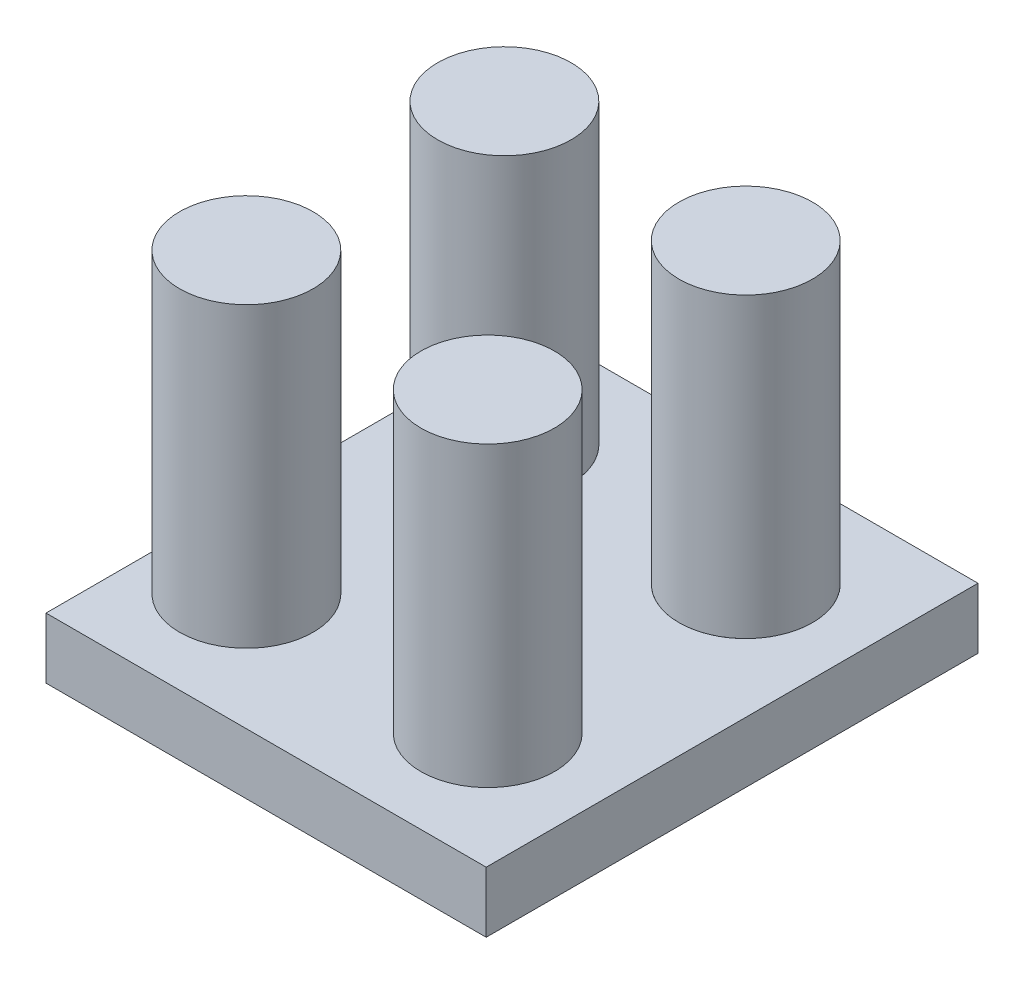
ISO-10303-21;
HEADER;
FILE_DESCRIPTION(('STEP AP214'),'2;1');
FILE_NAME('part.step','',(''),(''),'','','');
FILE_SCHEMA(('AUTOMOTIVE_DESIGN { 1 0 10303 214 1 1 1 1 }'));
ENDSEC;
DATA;
#1=APPLICATION_CONTEXT('core data for automotive mechanical design processes');
#2=APPLICATION_PROTOCOL_DEFINITION('international standard','automotive_design',2000,#1);
#3=PRODUCT_CONTEXT('',#1,'mechanical');
#4=PRODUCT('Part','Part','',(#3));
#5=PRODUCT_RELATED_PRODUCT_CATEGORY('part','',(#4));
#6=PRODUCT_DEFINITION_FORMATION('','',#4);
#7=PRODUCT_DEFINITION_CONTEXT('part definition',#1,'design');
#8=PRODUCT_DEFINITION('design','',#6,#7);
#9=PRODUCT_DEFINITION_SHAPE('','',#8);
#10=(LENGTH_UNIT() NAMED_UNIT(*) SI_UNIT(.MILLI.,.METRE.));
#11=(NAMED_UNIT(*) PLANE_ANGLE_UNIT() SI_UNIT($,.RADIAN.));
#12=(NAMED_UNIT(*) SI_UNIT($,.STERADIAN.) SOLID_ANGLE_UNIT());
#13=UNCERTAINTY_MEASURE_WITH_UNIT(LENGTH_MEASURE(1.E-05),#10,'distance_accuracy_value','');
#14=(GEOMETRIC_REPRESENTATION_CONTEXT(3) GLOBAL_UNCERTAINTY_ASSIGNED_CONTEXT((#13)) GLOBAL_UNIT_ASSIGNED_CONTEXT((#10,
#11,#12)) REPRESENTATION_CONTEXT('',''));
#15=CARTESIAN_POINT('',(0.,0.,0.));
#16=DIRECTION('',(0.,0.,1.));
#17=DIRECTION('',(1.,0.,0.));
#18=AXIS2_PLACEMENT_3D('',#15,#16,#17);
#19=CARTESIAN_POINT('',(-4.5,11.8,4.25));
#20=DIRECTION('',(0.,-1.,0.));
#21=DIRECTION('',(0.,0.,-1.));
#22=AXIS2_PLACEMENT_3D('',#19,#20,#21);
#23=CYLINDRICAL_SURFACE('',#22,2.2);
#24=CARTESIAN_POINT('',(-4.5,11.8,4.25));
#25=DIRECTION('',(0.,1.,0.));
#26=DIRECTION('',(0.,0.,1.));
#27=AXIS2_PLACEMENT_3D('',#24,#25,#26);
#28=CIRCLE('',#27,2.2);
#29=CARTESIAN_POINT('',(-4.5,11.8,6.45));
#30=VERTEX_POINT('',#29);
#31=EDGE_CURVE('E11',#30,#30,#28,.T.);
#32=ORIENTED_EDGE('',*,*,#31,.F.);
#33=EDGE_LOOP('',(#32));
#34=FACE_BOUND('',#33,.T.);
#35=CARTESIAN_POINT('',(-4.5,2.,4.25));
#36=DIRECTION('',(0.,1.,0.));
#37=DIRECTION('',(0.,0.,1.));
#38=AXIS2_PLACEMENT_3D('',#35,#36,#37);
#39=CIRCLE('',#38,2.2);
#40=CARTESIAN_POINT('',(-4.5,2.,6.45));
#41=VERTEX_POINT('',#40);
#42=EDGE_CURVE('E43',#41,#41,#39,.T.);
#43=ORIENTED_EDGE('',*,*,#42,.T.);
#44=EDGE_LOOP('',(#43));
#45=FACE_BOUND('',#44,.T.);
#46=ADVANCED_FACE('F40',(#34,#45),#23,.T.);
#47=CARTESIAN_POINT('',(-4.5,11.8,4.25));
#48=DIRECTION('',(0.,1.,0.));
#49=DIRECTION('',(0.,0.,1.));
#50=AXIS2_PLACEMENT_3D('',#47,#48,#49);
#51=PLANE('',#50);
#52=ORIENTED_EDGE('',*,*,#31,.T.);
#53=EDGE_LOOP('',(#52));
#54=FACE_BOUND('',#53,.T.);
#55=ADVANCED_FACE('F55',(#54),#51,.T.);
#56=CARTESIAN_POINT('',(-4.5,2.,4.25));
#57=DIRECTION('',(0.,1.,0.));
#58=DIRECTION('',(0.,0.,1.));
#59=AXIS2_PLACEMENT_3D('',#56,#57,#58);
#60=PLANE('',#59);
#61=ORIENTED_EDGE('',*,*,#42,.F.);
#62=EDGE_LOOP('',(#61));
#63=FACE_BOUND('',#62,.T.);
#64=ADVANCED_FACE('F53',(#63),#60,.F.);
#65=CLOSED_SHELL('',(#46,#55,#64));
#66=MANIFOLD_SOLID_BREP('B2',#65);
#67=CARTESIAN_POINT('',(3.45,11.8,4.25));
#68=DIRECTION('',(0.,-1.,0.));
#69=DIRECTION('',(0.,0.,-1.));
#70=AXIS2_PLACEMENT_3D('',#67,#68,#69);
#71=CYLINDRICAL_SURFACE('',#70,2.2);
#72=CARTESIAN_POINT('',(3.45,11.8,4.25));
#73=DIRECTION('',(0.,1.,0.));
#74=DIRECTION('',(0.,0.,1.));
#75=AXIS2_PLACEMENT_3D('',#72,#73,#74);
#76=CIRCLE('',#75,2.2);
#77=CARTESIAN_POINT('',(3.45,11.8,6.45));
#78=VERTEX_POINT('',#77);
#79=EDGE_CURVE('E39',#78,#78,#76,.T.);
#80=ORIENTED_EDGE('',*,*,#79,.F.);
#81=EDGE_LOOP('',(#80));
#82=FACE_BOUND('',#81,.T.);
#83=CARTESIAN_POINT('',(3.45,2.,4.25));
#84=DIRECTION('',(0.,1.,0.));
#85=DIRECTION('',(0.,0.,1.));
#86=AXIS2_PLACEMENT_3D('',#83,#84,#85);
#87=CIRCLE('',#86,2.2);
#88=CARTESIAN_POINT('',(3.45,2.,6.45));
#89=VERTEX_POINT('',#88);
#90=EDGE_CURVE('E92',#89,#89,#87,.T.);
#91=ORIENTED_EDGE('',*,*,#90,.T.);
#92=EDGE_LOOP('',(#91));
#93=FACE_BOUND('',#92,.T.);
#94=ADVANCED_FACE('F89',(#82,#93),#71,.T.);
#95=CARTESIAN_POINT('',(3.45,11.8,4.25));
#96=DIRECTION('',(0.,1.,0.));
#97=DIRECTION('',(0.,0.,1.));
#98=AXIS2_PLACEMENT_3D('',#95,#96,#97);
#99=PLANE('',#98);
#100=ORIENTED_EDGE('',*,*,#79,.T.);
#101=EDGE_LOOP('',(#100));
#102=FACE_BOUND('',#101,.T.);
#103=ADVANCED_FACE('F104',(#102),#99,.T.);
#104=CARTESIAN_POINT('',(3.45,2.,4.25));
#105=DIRECTION('',(0.,1.,0.));
#106=DIRECTION('',(0.,0.,1.));
#107=AXIS2_PLACEMENT_3D('',#104,#105,#106);
#108=PLANE('',#107);
#109=ORIENTED_EDGE('',*,*,#90,.F.);
#110=EDGE_LOOP('',(#109));
#111=FACE_BOUND('',#110,.T.);
#112=ADVANCED_FACE('F102',(#111),#108,.F.);
#113=CLOSED_SHELL('',(#94,#103,#112));
#114=MANIFOLD_SOLID_BREP('B6',#113);
#115=CARTESIAN_POINT('',(-4.5,11.8,-4.25000000000006));
#116=DIRECTION('',(0.,-1.,0.));
#117=DIRECTION('',(0.,0.,-1.));
#118=AXIS2_PLACEMENT_3D('',#115,#116,#117);
#119=CYLINDRICAL_SURFACE('',#118,2.2);
#120=CARTESIAN_POINT('',(-4.5,11.8,-4.25000000000006));
#121=DIRECTION('',(0.,1.,0.));
#122=DIRECTION('',(0.,0.,1.));
#123=AXIS2_PLACEMENT_3D('',#120,#121,#122);
#124=CIRCLE('',#123,2.2);
#125=CARTESIAN_POINT('',(-4.5,11.8,-2.05000000000006));
#126=VERTEX_POINT('',#125);
#127=EDGE_CURVE('E88',#126,#126,#124,.T.);
#128=ORIENTED_EDGE('',*,*,#127,.F.);
#129=EDGE_LOOP('',(#128));
#130=FACE_BOUND('',#129,.T.);
#131=CARTESIAN_POINT('',(-4.5,2.,-4.25000000000006));
#132=DIRECTION('',(0.,1.,0.));
#133=DIRECTION('',(0.,0.,1.));
#134=AXIS2_PLACEMENT_3D('',#131,#132,#133);
#135=CIRCLE('',#134,2.2);
#136=CARTESIAN_POINT('',(-4.5,2.,-2.05000000000006));
#137=VERTEX_POINT('',#136);
#138=EDGE_CURVE('E141',#137,#137,#135,.T.);
#139=ORIENTED_EDGE('',*,*,#138,.T.);
#140=EDGE_LOOP('',(#139));
#141=FACE_BOUND('',#140,.T.);
#142=ADVANCED_FACE('F138',(#130,#141),#119,.T.);
#143=CARTESIAN_POINT('',(-4.5,11.8,-4.25000000000006));
#144=DIRECTION('',(0.,1.,0.));
#145=DIRECTION('',(0.,0.,1.));
#146=AXIS2_PLACEMENT_3D('',#143,#144,#145);
#147=PLANE('',#146);
#148=ORIENTED_EDGE('',*,*,#127,.T.);
#149=EDGE_LOOP('',(#148));
#150=FACE_BOUND('',#149,.T.);
#151=ADVANCED_FACE('F153',(#150),#147,.T.);
#152=CARTESIAN_POINT('',(-4.5,2.,-4.25000000000006));
#153=DIRECTION('',(0.,1.,0.));
#154=DIRECTION('',(0.,0.,1.));
#155=AXIS2_PLACEMENT_3D('',#152,#153,#154);
#156=PLANE('',#155);
#157=ORIENTED_EDGE('',*,*,#138,.F.);
#158=EDGE_LOOP('',(#157));
#159=FACE_BOUND('',#158,.T.);
#160=ADVANCED_FACE('F151',(#159),#156,.F.);
#161=CLOSED_SHELL('',(#142,#151,#160));
#162=MANIFOLD_SOLID_BREP('B34',#161);
#163=CARTESIAN_POINT('',(3.45,11.8,-4.25000000000006));
#164=DIRECTION('',(0.,-1.,0.));
#165=DIRECTION('',(0.,0.,-1.));
#166=AXIS2_PLACEMENT_3D('',#163,#164,#165);
#167=CYLINDRICAL_SURFACE('',#166,2.2);
#168=CARTESIAN_POINT('',(3.45,11.8,-4.25000000000006));
#169=DIRECTION('',(0.,1.,0.));
#170=DIRECTION('',(0.,0.,1.));
#171=AXIS2_PLACEMENT_3D('',#168,#169,#170);
#172=CIRCLE('',#171,2.2);
#173=CARTESIAN_POINT('',(3.45,11.8,-2.05000000000006));
#174=VERTEX_POINT('',#173);
#175=EDGE_CURVE('E137',#174,#174,#172,.T.);
#176=ORIENTED_EDGE('',*,*,#175,.F.);
#177=EDGE_LOOP('',(#176));
#178=FACE_BOUND('',#177,.T.);
#179=CARTESIAN_POINT('',(3.45,2.,-4.25000000000006));
#180=DIRECTION('',(0.,1.,0.));
#181=DIRECTION('',(0.,0.,1.));
#182=AXIS2_PLACEMENT_3D('',#179,#180,#181);
#183=CIRCLE('',#182,2.2);
#184=CARTESIAN_POINT('',(3.45,2.,-2.05000000000006));
#185=VERTEX_POINT('',#184);
#186=EDGE_CURVE('E191',#185,#185,#183,.T.);
#187=ORIENTED_EDGE('',*,*,#186,.T.);
#188=EDGE_LOOP('',(#187));
#189=FACE_BOUND('',#188,.T.);
#190=ADVANCED_FACE('F188',(#178,#189),#167,.T.);
#191=CARTESIAN_POINT('',(3.45,11.8,-4.25000000000006));
#192=DIRECTION('',(0.,1.,0.));
#193=DIRECTION('',(0.,0.,1.));
#194=AXIS2_PLACEMENT_3D('',#191,#192,#193);
#195=PLANE('',#194);
#196=ORIENTED_EDGE('',*,*,#175,.T.);
#197=EDGE_LOOP('',(#196));
#198=FACE_BOUND('',#197,.T.);
#199=ADVANCED_FACE('F203',(#198),#195,.T.);
#200=CARTESIAN_POINT('',(3.45,2.,-4.25000000000006));
#201=DIRECTION('',(0.,1.,0.));
#202=DIRECTION('',(0.,0.,1.));
#203=AXIS2_PLACEMENT_3D('',#200,#201,#202);
#204=PLANE('',#203);
#205=ORIENTED_EDGE('',*,*,#186,.F.);
#206=EDGE_LOOP('',(#205));
#207=FACE_BOUND('',#206,.T.);
#208=ADVANCED_FACE('F201',(#207),#204,.F.);
#209=CLOSED_SHELL('',(#190,#199,#208));
#210=MANIFOLD_SOLID_BREP('B83',#209);
#211=CARTESIAN_POINT('',(0.,2.,0.));
#212=DIRECTION('',(0.,1.,0.));
#213=DIRECTION('',(0.,0.,1.));
#214=AXIS2_PLACEMENT_3D('',#211,#212,#213);
#215=PLANE('',#214);
#216=CARTESIAN_POINT('',(-4.5,2.,-4.25000000000006));
#217=DIRECTION('',(0.,1.,0.));
#218=DIRECTION('',(0.,0.,-1.));
#219=AXIS2_PLACEMENT_3D('',#216,#217,#218);
#220=CIRCLE('',#219,2.2);
#221=CARTESIAN_POINT('',(-4.5,2.,-6.45000000000005));
#222=VERTEX_POINT('',#221);
#223=EDGE_CURVE('E317',#222,#222,#220,.T.);
#224=ORIENTED_EDGE('',*,*,#223,.F.);
#225=EDGE_LOOP('',(#224));
#226=FACE_BOUND('',#225,.T.);
#227=CARTESIAN_POINT('',(3.45,2.,4.25));
#228=DIRECTION('',(0.,1.,0.));
#229=DIRECTION('',(0.,0.,1.));
#230=AXIS2_PLACEMENT_3D('',#227,#228,#229);
#231=CIRCLE('',#230,2.2);
#232=CARTESIAN_POINT('',(3.45,2.,6.45));
#233=VERTEX_POINT('',#232);
#234=EDGE_CURVE('E296',#233,#233,#231,.T.);
#235=ORIENTED_EDGE('',*,*,#234,.F.);
#236=EDGE_LOOP('',(#235));
#237=FACE_BOUND('',#236,.T.);
#238=DIRECTION('',(0.,0.,-1.));
#239=VECTOR('',#238,1.);
#240=CARTESIAN_POINT('',(7.25,2.,-8.10000000000004));
#241=LINE('',#240,#239);
#242=CARTESIAN_POINT('',(7.25,2.,8.09999999999998));
#243=VERTEX_POINT('',#242);
#244=CARTESIAN_POINT('',(7.25,2.,-8.10000000000004));
#245=VERTEX_POINT('',#244);
#246=EDGE_CURVE('E281',#243,#245,#241,.T.);
#247=ORIENTED_EDGE('',*,*,#246,.T.);
#248=DIRECTION('',(-1.,0.,0.));
#249=VECTOR('',#248,1.);
#250=CARTESIAN_POINT('',(-7.25,2.,-8.10000000000004));
#251=LINE('',#250,#249);
#252=CARTESIAN_POINT('',(-7.25,2.,-8.10000000000004));
#253=VERTEX_POINT('',#252);
#254=EDGE_CURVE('E276',#245,#253,#251,.T.);
#255=ORIENTED_EDGE('',*,*,#254,.T.);
#256=DIRECTION('',(0.,0.,1.));
#257=VECTOR('',#256,1.);
#258=CARTESIAN_POINT('',(-7.25,2.,-8.10000000000004));
#259=LINE('',#258,#257);
#260=CARTESIAN_POINT('',(-7.25,2.,8.09999999999998));
#261=VERTEX_POINT('',#260);
#262=EDGE_CURVE('E279',#253,#261,#259,.T.);
#263=ORIENTED_EDGE('',*,*,#262,.T.);
#264=DIRECTION('',(1.,0.,0.));
#265=VECTOR('',#264,1.);
#266=CARTESIAN_POINT('',(-7.25,2.,8.09999999999998));
#267=LINE('',#266,#265);
#268=EDGE_CURVE('E246',#261,#243,#267,.T.);
#269=ORIENTED_EDGE('',*,*,#268,.T.);
#270=EDGE_LOOP('',(#247,#255,#263,#269));
#271=FACE_BOUND('',#270,.T.);
#272=CARTESIAN_POINT('',(-4.5,2.,4.25));
#273=DIRECTION('',(0.,1.,0.));
#274=DIRECTION('',(0.,0.,1.));
#275=AXIS2_PLACEMENT_3D('',#272,#273,#274);
#276=CIRCLE('',#275,2.2);
#277=CARTESIAN_POINT('',(-4.5,2.,6.45));
#278=VERTEX_POINT('',#277);
#279=EDGE_CURVE('E311',#278,#278,#276,.T.);
#280=ORIENTED_EDGE('',*,*,#279,.F.);
#281=EDGE_LOOP('',(#280));
#282=FACE_BOUND('',#281,.T.);
#283=CARTESIAN_POINT('',(3.45,2.,-4.25000000000006));
#284=DIRECTION('',(0.,1.,0.));
#285=DIRECTION('',(0.,0.,-1.));
#286=AXIS2_PLACEMENT_3D('',#283,#284,#285);
#287=CIRCLE('',#286,2.2);
#288=CARTESIAN_POINT('',(3.45,2.,-6.45000000000005));
#289=VERTEX_POINT('',#288);
#290=EDGE_CURVE('E323',#289,#289,#287,.T.);
#291=ORIENTED_EDGE('',*,*,#290,.F.);
#292=EDGE_LOOP('',(#291));
#293=FACE_BOUND('',#292,.T.);
#294=ADVANCED_FACE('F229',(#226,#237,#271,#282,#293),#215,.T.);
#295=CARTESIAN_POINT('',(0.,0.,0.));
#296=DIRECTION('',(0.,1.,0.));
#297=DIRECTION('',(0.,0.,1.));
#298=AXIS2_PLACEMENT_3D('',#295,#296,#297);
#299=PLANE('',#298);
#300=DIRECTION('',(0.,0.,-1.));
#301=VECTOR('',#300,1.);
#302=CARTESIAN_POINT('',(7.25,0.,-8.10000000000004));
#303=LINE('',#302,#301);
#304=CARTESIAN_POINT('',(7.25,0.,8.09999999999998));
#305=VERTEX_POINT('',#304);
#306=CARTESIAN_POINT('',(7.25,0.,-8.10000000000004));
#307=VERTEX_POINT('',#306);
#308=EDGE_CURVE('E293',#305,#307,#303,.T.);
#309=ORIENTED_EDGE('',*,*,#308,.F.);
#310=DIRECTION('',(1.,0.,0.));
#311=VECTOR('',#310,1.);
#312=CARTESIAN_POINT('',(-7.25,0.,8.09999999999998));
#313=LINE('',#312,#311);
#314=CARTESIAN_POINT('',(-7.25,0.,8.09999999999998));
#315=VERTEX_POINT('',#314);
#316=EDGE_CURVE('E269',#315,#305,#313,.T.);
#317=ORIENTED_EDGE('',*,*,#316,.F.);
#318=DIRECTION('',(0.,0.,1.));
#319=VECTOR('',#318,1.);
#320=CARTESIAN_POINT('',(-7.25,0.,-8.10000000000004));
#321=LINE('',#320,#319);
#322=CARTESIAN_POINT('',(-7.25,0.,-8.10000000000004));
#323=VERTEX_POINT('',#322);
#324=EDGE_CURVE('E263',#323,#315,#321,.T.);
#325=ORIENTED_EDGE('',*,*,#324,.F.);
#326=DIRECTION('',(-1.,0.,0.));
#327=VECTOR('',#326,1.);
#328=CARTESIAN_POINT('',(-7.25,0.,-8.10000000000004));
#329=LINE('',#328,#327);
#330=EDGE_CURVE('E285',#307,#323,#329,.T.);
#331=ORIENTED_EDGE('',*,*,#330,.F.);
#332=EDGE_LOOP('',(#309,#317,#325,#331));
#333=FACE_BOUND('',#332,.T.);
#334=CARTESIAN_POINT('',(3.45,0.,4.25));
#335=DIRECTION('',(0.,1.,0.));
#336=DIRECTION('',(0.,0.,1.));
#337=AXIS2_PLACEMENT_3D('',#334,#335,#336);
#338=CIRCLE('',#337,2.2);
#339=CARTESIAN_POINT('',(3.45,0.,6.45));
#340=VERTEX_POINT('',#339);
#341=EDGE_CURVE('E308',#340,#340,#338,.T.);
#342=ORIENTED_EDGE('',*,*,#341,.T.);
#343=EDGE_LOOP('',(#342));
#344=FACE_BOUND('',#343,.T.);
#345=CARTESIAN_POINT('',(-4.5,0.,4.25));
#346=DIRECTION('',(0.,1.,0.));
#347=DIRECTION('',(0.,0.,1.));
#348=AXIS2_PLACEMENT_3D('',#345,#346,#347);
#349=CIRCLE('',#348,2.2);
#350=CARTESIAN_POINT('',(-4.5,0.,6.45));
#351=VERTEX_POINT('',#350);
#352=EDGE_CURVE('E314',#351,#351,#349,.T.);
#353=ORIENTED_EDGE('',*,*,#352,.T.);
#354=EDGE_LOOP('',(#353));
#355=FACE_BOUND('',#354,.T.);
#356=CARTESIAN_POINT('',(-4.5,0.,-4.25000000000006));
#357=DIRECTION('',(0.,1.,0.));
#358=DIRECTION('',(0.,0.,-1.));
#359=AXIS2_PLACEMENT_3D('',#356,#357,#358);
#360=CIRCLE('',#359,2.2);
#361=CARTESIAN_POINT('',(-4.5,0.,-6.45000000000005));
#362=VERTEX_POINT('',#361);
#363=EDGE_CURVE('E320',#362,#362,#360,.T.);
#364=ORIENTED_EDGE('',*,*,#363,.T.);
#365=EDGE_LOOP('',(#364));
#366=FACE_BOUND('',#365,.T.);
#367=CARTESIAN_POINT('',(3.45,0.,-4.25000000000006));
#368=DIRECTION('',(0.,1.,0.));
#369=DIRECTION('',(0.,0.,-1.));
#370=AXIS2_PLACEMENT_3D('',#367,#368,#369);
#371=CIRCLE('',#370,2.2);
#372=CARTESIAN_POINT('',(3.45,0.,-6.45000000000005));
#373=VERTEX_POINT('',#372);
#374=EDGE_CURVE('E326',#373,#373,#371,.T.);
#375=ORIENTED_EDGE('',*,*,#374,.T.);
#376=EDGE_LOOP('',(#375));
#377=FACE_BOUND('',#376,.T.);
#378=ADVANCED_FACE('F304',(#333,#344,#355,#366,#377),#299,.F.);
#379=CARTESIAN_POINT('',(7.25,2.,-8.10000000000004));
#380=DIRECTION('',(-1.,0.,0.));
#381=DIRECTION('',(0.,0.,1.));
#382=AXIS2_PLACEMENT_3D('',#379,#380,#381);
#383=PLANE('',#382);
#384=ORIENTED_EDGE('',*,*,#308,.T.);
#385=DIRECTION('',(0.,-1.,0.));
#386=VECTOR('',#385,1.);
#387=CARTESIAN_POINT('',(7.25,2.,-8.10000000000004));
#388=LINE('',#387,#386);
#389=EDGE_CURVE('E186',#245,#307,#388,.T.);
#390=ORIENTED_EDGE('',*,*,#389,.F.);
#391=ORIENTED_EDGE('',*,*,#246,.F.);
#392=DIRECTION('',(0.,-1.,0.));
#393=VECTOR('',#392,1.);
#394=CARTESIAN_POINT('',(7.25,2.,8.09999999999998));
#395=LINE('',#394,#393);
#396=EDGE_CURVE('E289',#243,#305,#395,.T.);
#397=ORIENTED_EDGE('',*,*,#396,.T.);
#398=EDGE_LOOP('',(#384,#390,#391,#397));
#399=FACE_BOUND('',#398,.T.);
#400=ADVANCED_FACE('F231',(#399),#383,.F.);
#401=CARTESIAN_POINT('',(-7.25,2.,-8.10000000000004));
#402=DIRECTION('',(0.,0.,1.));
#403=DIRECTION('',(1.,0.,0.));
#404=AXIS2_PLACEMENT_3D('',#401,#402,#403);
#405=PLANE('',#404);
#406=ORIENTED_EDGE('',*,*,#330,.T.);
#407=DIRECTION('',(0.,-1.,0.));
#408=VECTOR('',#407,1.);
#409=CARTESIAN_POINT('',(-7.25,2.,-8.10000000000004));
#410=LINE('',#409,#408);
#411=EDGE_CURVE('E238',#253,#323,#410,.T.);
#412=ORIENTED_EDGE('',*,*,#411,.F.);
#413=ORIENTED_EDGE('',*,*,#254,.F.);
#414=ORIENTED_EDGE('',*,*,#389,.T.);
#415=EDGE_LOOP('',(#406,#412,#413,#414));
#416=FACE_BOUND('',#415,.T.);
#417=ADVANCED_FACE('F284',(#416),#405,.F.);
#418=CARTESIAN_POINT('',(-7.25,2.,-8.10000000000004));
#419=DIRECTION('',(1.,0.,0.));
#420=DIRECTION('',(0.,0.,-1.));
#421=AXIS2_PLACEMENT_3D('',#418,#419,#420);
#422=PLANE('',#421);
#423=ORIENTED_EDGE('',*,*,#324,.T.);
#424=DIRECTION('',(0.,-1.,0.));
#425=VECTOR('',#424,1.);
#426=CARTESIAN_POINT('',(-7.25,2.,8.09999999999998));
#427=LINE('',#426,#425);
#428=EDGE_CURVE('E286',#261,#315,#427,.T.);
#429=ORIENTED_EDGE('',*,*,#428,.F.);
#430=ORIENTED_EDGE('',*,*,#262,.F.);
#431=ORIENTED_EDGE('',*,*,#411,.T.);
#432=EDGE_LOOP('',(#423,#429,#430,#431));
#433=FACE_BOUND('',#432,.T.);
#434=ADVANCED_FACE('F287',(#433),#422,.F.);
#435=CARTESIAN_POINT('',(-7.25,2.,8.09999999999998));
#436=DIRECTION('',(0.,0.,-1.));
#437=DIRECTION('',(-1.,0.,0.));
#438=AXIS2_PLACEMENT_3D('',#435,#436,#437);
#439=PLANE('',#438);
#440=ORIENTED_EDGE('',*,*,#316,.T.);
#441=ORIENTED_EDGE('',*,*,#396,.F.);
#442=ORIENTED_EDGE('',*,*,#268,.F.);
#443=ORIENTED_EDGE('',*,*,#428,.T.);
#444=EDGE_LOOP('',(#440,#441,#442,#443));
#445=FACE_BOUND('',#444,.T.);
#446=ADVANCED_FACE('F301',(#445),#439,.F.);
#447=CARTESIAN_POINT('',(3.45,2.,4.25));
#448=DIRECTION('',(0.,-1.,0.));
#449=DIRECTION('',(0.,0.,-1.));
#450=AXIS2_PLACEMENT_3D('',#447,#448,#449);
#451=CYLINDRICAL_SURFACE('',#450,2.2);
#452=ORIENTED_EDGE('',*,*,#234,.T.);
#453=EDGE_LOOP('',(#452));
#454=FACE_BOUND('',#453,.T.);
#455=ORIENTED_EDGE('',*,*,#341,.F.);
#456=EDGE_LOOP('',(#455));
#457=FACE_BOUND('',#456,.T.);
#458=ADVANCED_FACE('F345',(#454,#457),#451,.F.);
#459=CARTESIAN_POINT('',(-4.5,2.,4.25));
#460=DIRECTION('',(0.,-1.,0.));
#461=DIRECTION('',(0.,0.,-1.));
#462=AXIS2_PLACEMENT_3D('',#459,#460,#461);
#463=CYLINDRICAL_SURFACE('',#462,2.2);
#464=ORIENTED_EDGE('',*,*,#279,.T.);
#465=EDGE_LOOP('',(#464));
#466=FACE_BOUND('',#465,.T.);
#467=ORIENTED_EDGE('',*,*,#352,.F.);
#468=EDGE_LOOP('',(#467));
#469=FACE_BOUND('',#468,.T.);
#470=ADVANCED_FACE('F391',(#466,#469),#463,.F.);
#471=CARTESIAN_POINT('',(-4.5,2.,-4.25000000000006));
#472=DIRECTION('',(0.,-1.,0.));
#473=DIRECTION('',(0.,0.,-1.));
#474=AXIS2_PLACEMENT_3D('',#471,#472,#473);
#475=CYLINDRICAL_SURFACE('',#474,2.2);
#476=ORIENTED_EDGE('',*,*,#223,.T.);
#477=EDGE_LOOP('',(#476));
#478=FACE_BOUND('',#477,.T.);
#479=ORIENTED_EDGE('',*,*,#363,.F.);
#480=EDGE_LOOP('',(#479));
#481=FACE_BOUND('',#480,.T.);
#482=ADVANCED_FACE('F399',(#478,#481),#475,.F.);
#483=CARTESIAN_POINT('',(3.45,2.,-4.25000000000006));
#484=DIRECTION('',(0.,-1.,0.));
#485=DIRECTION('',(0.,0.,-1.));
#486=AXIS2_PLACEMENT_3D('',#483,#484,#485);
#487=CYLINDRICAL_SURFACE('',#486,2.2);
#488=ORIENTED_EDGE('',*,*,#290,.T.);
#489=EDGE_LOOP('',(#488));
#490=FACE_BOUND('',#489,.T.);
#491=ORIENTED_EDGE('',*,*,#374,.F.);
#492=EDGE_LOOP('',(#491));
#493=FACE_BOUND('',#492,.T.);
#494=ADVANCED_FACE('F332',(#490,#493),#487,.F.);
#495=CLOSED_SHELL('',(#294,#378,#400,#417,#434,#446,#458,#470,#482,#494));
#496=MANIFOLD_SOLID_BREP('B132',#495);
#497=ADVANCED_BREP_SHAPE_REPRESENTATION('',(#18,#66,#114,#162,#210,#496),#14);
#498=SHAPE_DEFINITION_REPRESENTATION(#9,#497);
ENDSEC;
END-ISO-10303-21;
